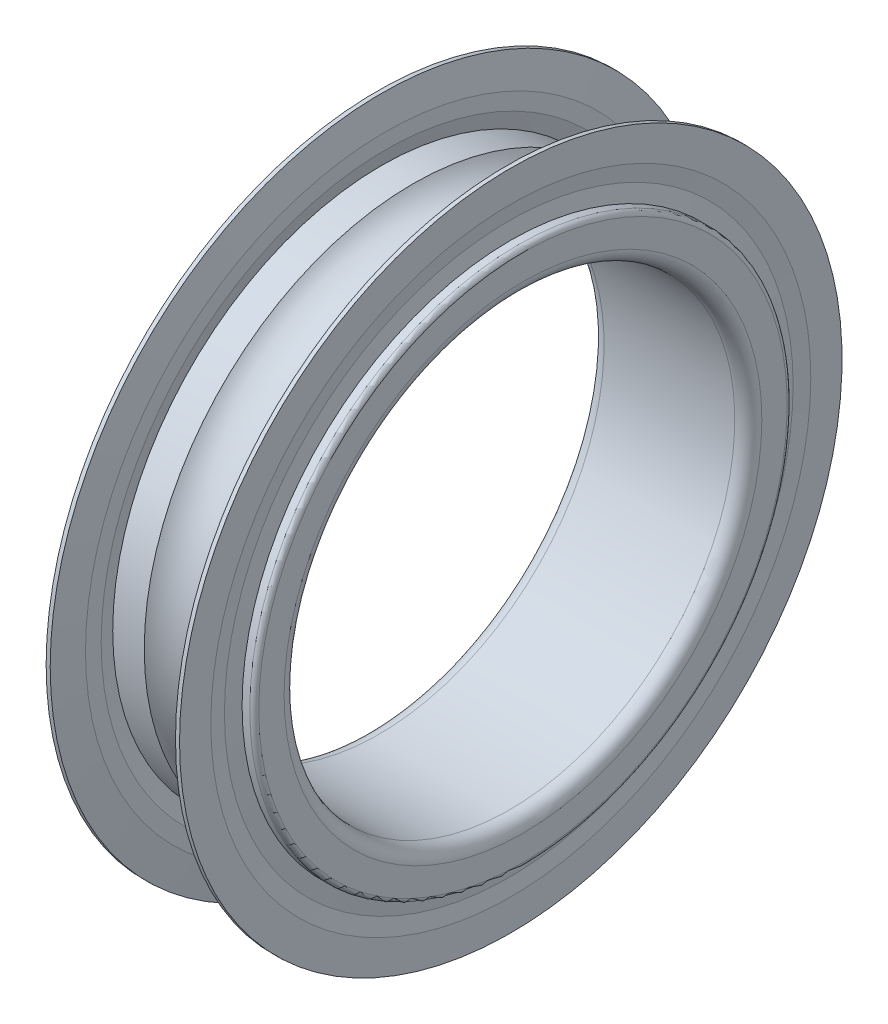
ISO-10303-21;
HEADER;
FILE_DESCRIPTION(('STEP AP214'),'2;1');
FILE_NAME('part.step','',(''),(''),'','','');
FILE_SCHEMA(('AUTOMOTIVE_DESIGN { 1 0 10303 214 1 1 1 1 }'));
ENDSEC;
DATA;
#1=APPLICATION_CONTEXT('core data for automotive mechanical design processes');
#2=APPLICATION_PROTOCOL_DEFINITION('international standard','automotive_design',2000,#1);
#3=PRODUCT_CONTEXT('',#1,'mechanical');
#4=PRODUCT('Part','Part','',(#3));
#5=PRODUCT_RELATED_PRODUCT_CATEGORY('part','',(#4));
#6=PRODUCT_DEFINITION_FORMATION('','',#4);
#7=PRODUCT_DEFINITION_CONTEXT('part definition',#1,'design');
#8=PRODUCT_DEFINITION('design','',#6,#7);
#9=PRODUCT_DEFINITION_SHAPE('','',#8);
#10=(LENGTH_UNIT() NAMED_UNIT(*) SI_UNIT(.MILLI.,.METRE.));
#11=(NAMED_UNIT(*) PLANE_ANGLE_UNIT() SI_UNIT($,.RADIAN.));
#12=(NAMED_UNIT(*) SI_UNIT($,.STERADIAN.) SOLID_ANGLE_UNIT());
#13=UNCERTAINTY_MEASURE_WITH_UNIT(LENGTH_MEASURE(1.E-05),#10,'distance_accuracy_value','');
#14=(GEOMETRIC_REPRESENTATION_CONTEXT(3) GLOBAL_UNCERTAINTY_ASSIGNED_CONTEXT((#13)) GLOBAL_UNIT_ASSIGNED_CONTEXT((#10,
#11,#12)) REPRESENTATION_CONTEXT('',''));
#15=CARTESIAN_POINT('',(0.,0.,0.));
#16=DIRECTION('',(0.,0.,1.));
#17=DIRECTION('',(1.,0.,0.));
#18=AXIS2_PLACEMENT_3D('',#15,#16,#17);
#19=CARTESIAN_POINT('',(0.,-12.0453733965146,-11.725));
#20=DIRECTION('',(-1.,0.,0.));
#21=DIRECTION('',(0.,0.,1.));
#22=AXIS2_PLACEMENT_3D('',#19,#20,#21);
#23=PLANE('',#22);
#24=CARTESIAN_POINT('',(0.,0.,0.));
#25=DIRECTION('',(-1.,0.,0.));
#26=DIRECTION('',(0.,0.,-1.));
#27=AXIS2_PLACEMENT_3D('',#24,#25,#26);
#28=CIRCLE('',#27,11.725000013978);
#29=CARTESIAN_POINT('',(0.,0.,-11.725000013978));
#30=VERTEX_POINT('',#29);
#31=EDGE_CURVE('E100',#30,#30,#28,.F.);
#32=ORIENTED_EDGE('',*,*,#31,.F.);
#33=EDGE_LOOP('',(#32));
#34=FACE_BOUND('',#33,.T.);
#35=CARTESIAN_POINT('',(0.,0.,0.));
#36=DIRECTION('',(1.,0.,0.));
#37=DIRECTION('',(0.,0.,1.));
#38=AXIS2_PLACEMENT_3D('',#35,#36,#37);
#39=CIRCLE('',#38,10.5999999999999);
#40=CARTESIAN_POINT('',(0.,0.,10.5999999999999));
#41=VERTEX_POINT('',#40);
#42=EDGE_CURVE('E97',#41,#41,#39,.T.);
#43=ORIENTED_EDGE('',*,*,#42,.T.);
#44=EDGE_LOOP('',(#43));
#45=FACE_BOUND('',#44,.T.);
#46=ADVANCED_FACE('F17',(#34,#45),#23,.T.);
#47=CARTESIAN_POINT('',(7.,-12.0453734035495,11.725));
#48=DIRECTION('',(1.,0.,0.));
#49=DIRECTION('',(0.,0.,-1.));
#50=AXIS2_PLACEMENT_3D('',#47,#48,#49);
#51=PLANE('',#50);
#52=CARTESIAN_POINT('',(7.,0.,0.));
#53=DIRECTION('',(1.,0.,0.));
#54=DIRECTION('',(0.,0.,1.));
#55=AXIS2_PLACEMENT_3D('',#52,#53,#54);
#56=CIRCLE('',#55,11.725);
#57=CARTESIAN_POINT('',(7.,0.,11.725));
#58=VERTEX_POINT('',#57);
#59=EDGE_CURVE('E94',#58,#58,#56,.T.);
#60=ORIENTED_EDGE('',*,*,#59,.T.);
#61=EDGE_LOOP('',(#60));
#62=FACE_BOUND('',#61,.T.);
#63=CARTESIAN_POINT('',(7.,0.,0.));
#64=DIRECTION('',(-1.,0.,0.));
#65=DIRECTION('',(0.,0.,-1.));
#66=AXIS2_PLACEMENT_3D('',#63,#64,#65);
#67=CIRCLE('',#66,10.6);
#68=CARTESIAN_POINT('',(7.,0.,-10.6));
#69=VERTEX_POINT('',#68);
#70=EDGE_CURVE('E91',#69,#69,#67,.F.);
#71=ORIENTED_EDGE('',*,*,#70,.F.);
#72=EDGE_LOOP('',(#71));
#73=FACE_BOUND('',#72,.T.);
#74=ADVANCED_FACE('F109',(#62,#73),#51,.T.);
#75=CARTESIAN_POINT('',(0.9,-13.5597975760758,13.3125));
#76=DIRECTION('',(1.,0.,0.));
#77=DIRECTION('',(0.,0.,-1.));
#78=AXIS2_PLACEMENT_3D('',#75,#76,#77);
#79=PLANE('',#78);
#80=CARTESIAN_POINT('',(0.9,0.,0.));
#81=DIRECTION('',(1.,0.,0.));
#82=DIRECTION('',(0.,0.,1.));
#83=AXIS2_PLACEMENT_3D('',#80,#81,#82);
#84=CIRCLE('',#83,13.3125);
#85=CARTESIAN_POINT('',(0.9,0.,13.3125));
#86=VERTEX_POINT('',#85);
#87=EDGE_CURVE('E88',#86,#86,#84,.T.);
#88=ORIENTED_EDGE('',*,*,#87,.T.);
#89=EDGE_LOOP('',(#88));
#90=FACE_BOUND('',#89,.T.);
#91=CARTESIAN_POINT('',(0.9,0.,0.));
#92=DIRECTION('',(-1.,0.,0.));
#93=DIRECTION('',(0.,0.,-1.));
#94=AXIS2_PLACEMENT_3D('',#91,#92,#93);
#95=CIRCLE('',#94,12.61875);
#96=CARTESIAN_POINT('',(0.9,0.,-12.61875));
#97=VERTEX_POINT('',#96);
#98=EDGE_CURVE('E85',#97,#97,#95,.F.);
#99=ORIENTED_EDGE('',*,*,#98,.F.);
#100=EDGE_LOOP('',(#99));
#101=FACE_BOUND('',#100,.T.);
#102=ADVANCED_FACE('F218',(#90,#101),#79,.T.);
#103=CARTESIAN_POINT('',(0.54,-14.9730722443665,-14.7));
#104=DIRECTION('',(-1.,0.,0.));
#105=DIRECTION('',(0.,0.,1.));
#106=AXIS2_PLACEMENT_3D('',#103,#104,#105);
#107=PLANE('',#106);
#108=CARTESIAN_POINT('',(0.54,0.,0.));
#109=DIRECTION('',(-1.,0.,0.));
#110=DIRECTION('',(0.,0.,-1.));
#111=AXIS2_PLACEMENT_3D('',#108,#109,#110);
#112=CIRCLE('',#111,14.7);
#113=CARTESIAN_POINT('',(0.54,0.,-14.7));
#114=VERTEX_POINT('',#113);
#115=EDGE_CURVE('E82',#114,#114,#112,.F.);
#116=ORIENTED_EDGE('',*,*,#115,.F.);
#117=EDGE_LOOP('',(#116));
#118=FACE_BOUND('',#117,.T.);
#119=CARTESIAN_POINT('',(0.54,0.,0.));
#120=DIRECTION('',(1.,0.,0.));
#121=DIRECTION('',(0.,0.,1.));
#122=AXIS2_PLACEMENT_3D('',#119,#120,#121);
#123=CIRCLE('',#122,13.3125);
#124=CARTESIAN_POINT('',(0.54,0.,13.3125));
#125=VERTEX_POINT('',#124);
#126=EDGE_CURVE('E79',#125,#125,#123,.T.);
#127=ORIENTED_EDGE('',*,*,#126,.T.);
#128=EDGE_LOOP('',(#127));
#129=FACE_BOUND('',#128,.T.);
#130=ADVANCED_FACE('F201',(#118,#129),#107,.T.);
#131=CARTESIAN_POINT('',(6.1,-13.5597975760758,-13.3125));
#132=DIRECTION('',(-1.,0.,0.));
#133=DIRECTION('',(0.,0.,1.));
#134=AXIS2_PLACEMENT_3D('',#131,#132,#133);
#135=PLANE('',#134);
#136=CARTESIAN_POINT('',(6.1,0.,0.));
#137=DIRECTION('',(-1.,0.,0.));
#138=DIRECTION('',(0.,0.,-1.));
#139=AXIS2_PLACEMENT_3D('',#136,#137,#138);
#140=CIRCLE('',#139,13.3125);
#141=CARTESIAN_POINT('',(6.1,0.,-13.3125));
#142=VERTEX_POINT('',#141);
#143=EDGE_CURVE('E76',#142,#142,#140,.F.);
#144=ORIENTED_EDGE('',*,*,#143,.F.);
#145=EDGE_LOOP('',(#144));
#146=FACE_BOUND('',#145,.T.);
#147=CARTESIAN_POINT('',(6.1,0.,0.));
#148=DIRECTION('',(1.,0.,0.));
#149=DIRECTION('',(0.,0.,1.));
#150=AXIS2_PLACEMENT_3D('',#147,#148,#149);
#151=CIRCLE('',#150,12.61875);
#152=CARTESIAN_POINT('',(6.1,0.,12.61875));
#153=VERTEX_POINT('',#152);
#154=EDGE_CURVE('E73',#153,#153,#151,.T.);
#155=ORIENTED_EDGE('',*,*,#154,.T.);
#156=EDGE_LOOP('',(#155));
#157=FACE_BOUND('',#156,.T.);
#158=ADVANCED_FACE('F192',(#146,#157),#135,.T.);
#159=CARTESIAN_POINT('',(6.46,-14.9730722274429,14.7));
#160=DIRECTION('',(1.,0.,0.));
#161=DIRECTION('',(0.,0.,-1.));
#162=AXIS2_PLACEMENT_3D('',#159,#160,#161);
#163=PLANE('',#162);
#164=CARTESIAN_POINT('',(6.46,0.,0.));
#165=DIRECTION('',(1.,0.,0.));
#166=DIRECTION('',(0.,-1.16855761650625E-09,1.));
#167=AXIS2_PLACEMENT_3D('',#164,#165,#166);
#168=CIRCLE('',#167,14.7);
#169=CARTESIAN_POINT('',(6.46,-1.71777969626419E-08,14.7));
#170=VERTEX_POINT('',#169);
#171=EDGE_CURVE('E70',#170,#170,#168,.T.);
#172=ORIENTED_EDGE('',*,*,#171,.T.);
#173=EDGE_LOOP('',(#172));
#174=FACE_BOUND('',#173,.T.);
#175=CARTESIAN_POINT('',(6.46,0.,0.));
#176=DIRECTION('',(-1.,0.,0.));
#177=DIRECTION('',(0.,0.,-1.));
#178=AXIS2_PLACEMENT_3D('',#175,#176,#177);
#179=CIRCLE('',#178,13.3125);
#180=CARTESIAN_POINT('',(6.46,0.,-13.3125));
#181=VERTEX_POINT('',#180);
#182=EDGE_CURVE('E67',#181,#181,#179,.F.);
#183=ORIENTED_EDGE('',*,*,#182,.F.);
#184=EDGE_LOOP('',(#183));
#185=FACE_BOUND('',#184,.T.);
#186=ADVANCED_FACE('F189',(#174,#185),#163,.T.);
#187=CARTESIAN_POINT('',(50.,0.,0.));
#188=DIRECTION('',(1.,0.,0.));
#189=DIRECTION('',(0.,1.92337823786001E-10,1.));
#190=AXIS2_PLACEMENT_3D('',#187,#188,#189);
#191=CYLINDRICAL_SURFACE('',#190,11.925);
#192=CARTESIAN_POINT('',(4.8808964479641,0.,0.));
#193=DIRECTION('',(1.,0.,0.));
#194=DIRECTION('',(0.,0.,1.));
#195=AXIS2_PLACEMENT_3D('',#192,#193,#194);
#196=CIRCLE('',#195,11.925);
#197=CARTESIAN_POINT('',(4.8808964479641,0.,11.925));
#198=VERTEX_POINT('',#197);
#199=EDGE_CURVE('E64',#198,#198,#196,.T.);
#200=ORIENTED_EDGE('',*,*,#199,.T.);
#201=EDGE_LOOP('',(#200));
#202=FACE_BOUND('',#201,.T.);
#203=CARTESIAN_POINT('',(6.28,0.,0.));
#204=DIRECTION('',(-1.,0.,0.));
#205=DIRECTION('',(0.,0.,-1.));
#206=AXIS2_PLACEMENT_3D('',#203,#204,#205);
#207=CIRCLE('',#206,11.925);
#208=CARTESIAN_POINT('',(6.28,0.,-11.925));
#209=VERTEX_POINT('',#208);
#210=EDGE_CURVE('E61',#209,#209,#207,.F.);
#211=ORIENTED_EDGE('',*,*,#210,.F.);
#212=EDGE_LOOP('',(#211));
#213=FACE_BOUND('',#212,.T.);
#214=ADVANCED_FACE('F191',(#202,#213),#191,.T.);
#215=CARTESIAN_POINT('',(50.,0.,0.));
#216=DIRECTION('',(1.,0.,0.));
#217=DIRECTION('',(0.,1.92337379696791E-10,1.));
#218=AXIS2_PLACEMENT_3D('',#215,#216,#217);
#219=CYLINDRICAL_SURFACE('',#218,11.925);
#220=CARTESIAN_POINT('',(0.200000000000003,0.,0.));
#221=DIRECTION('',(1.,0.,0.));
#222=DIRECTION('',(0.,0.,1.));
#223=AXIS2_PLACEMENT_3D('',#220,#221,#222);
#224=CIRCLE('',#223,11.925);
#225=CARTESIAN_POINT('',(0.200000000000003,0.,11.925));
#226=VERTEX_POINT('',#225);
#227=EDGE_CURVE('E58',#226,#226,#224,.T.);
#228=ORIENTED_EDGE('',*,*,#227,.T.);
#229=EDGE_LOOP('',(#228));
#230=FACE_BOUND('',#229,.T.);
#231=CARTESIAN_POINT('',(0.539999999999999,0.,0.));
#232=DIRECTION('',(-1.,0.,0.));
#233=DIRECTION('',(0.,0.,-1.));
#234=AXIS2_PLACEMENT_3D('',#231,#232,#233);
#235=CIRCLE('',#234,11.925);
#236=CARTESIAN_POINT('',(0.539999999999999,0.,-11.925));
#237=VERTEX_POINT('',#236);
#238=EDGE_CURVE('E55',#237,#237,#235,.F.);
#239=ORIENTED_EDGE('',*,*,#238,.F.);
#240=EDGE_LOOP('',(#239));
#241=FACE_BOUND('',#240,.T.);
#242=ADVANCED_FACE('F126',(#230,#241),#219,.T.);
#243=CARTESIAN_POINT('',(0.200000000000531,0.,0.));
#244=DIRECTION('',(1.,0.,0.));
#245=DIRECTION('',(0.,1.16848720733295E-09,1.));
#246=AXIS2_PLACEMENT_3D('',#243,#244,#245);
#247=TOROIDAL_SURFACE('',#246,11.7249999999995,0.200000000000532);
#248=ORIENTED_EDGE('',*,*,#31,.T.);
#249=EDGE_LOOP('',(#248));
#250=FACE_BOUND('',#249,.T.);
#251=ORIENTED_EDGE('',*,*,#227,.F.);
#252=EDGE_LOOP('',(#251));
#253=FACE_BOUND('',#252,.T.);
#254=ADVANCED_FACE('F104',(#250,#253),#247,.T.);
#255=CARTESIAN_POINT('',(0.599999999999877,0.,0.));
#256=DIRECTION('',(1.,0.,0.));
#257=DIRECTION('',(0.,0.,1.));
#258=AXIS2_PLACEMENT_3D('',#255,#256,#257);
#259=TOROIDAL_SURFACE('',#258,10.5999999999999,0.599999999999877);
#260=CARTESIAN_POINT('',(0.6,0.,0.));
#261=DIRECTION('',(1.,0.,0.));
#262=DIRECTION('',(0.,0.,1.));
#263=AXIS2_PLACEMENT_3D('',#260,#261,#262);
#264=CIRCLE('',#263,10.);
#265=CARTESIAN_POINT('',(0.6,0.,10.));
#266=VERTEX_POINT('',#265);
#267=EDGE_CURVE('E52',#266,#266,#264,.T.);
#268=ORIENTED_EDGE('',*,*,#267,.T.);
#269=EDGE_LOOP('',(#268));
#270=FACE_BOUND('',#269,.T.);
#271=ORIENTED_EDGE('',*,*,#42,.F.);
#272=EDGE_LOOP('',(#271));
#273=FACE_BOUND('',#272,.T.);
#274=ADVANCED_FACE('F113',(#270,#273),#259,.T.);
#275=CARTESIAN_POINT('',(50.,0.,0.));
#276=DIRECTION('',(1.,0.,0.));
#277=DIRECTION('',(0.,0.,1.));
#278=AXIS2_PLACEMENT_3D('',#275,#276,#277);
#279=CYLINDRICAL_SURFACE('',#278,10.);
#280=CARTESIAN_POINT('',(6.4,0.,0.));
#281=DIRECTION('',(1.,0.,0.));
#282=DIRECTION('',(0.,0.,1.));
#283=AXIS2_PLACEMENT_3D('',#280,#281,#282);
#284=CIRCLE('',#283,10.);
#285=CARTESIAN_POINT('',(6.4,0.,10.));
#286=VERTEX_POINT('',#285);
#287=EDGE_CURVE('E49',#286,#286,#284,.T.);
#288=ORIENTED_EDGE('',*,*,#287,.T.);
#289=EDGE_LOOP('',(#288));
#290=FACE_BOUND('',#289,.T.);
#291=ORIENTED_EDGE('',*,*,#267,.F.);
#292=EDGE_LOOP('',(#291));
#293=FACE_BOUND('',#292,.T.);
#294=ADVANCED_FACE('F115',(#290,#293),#279,.F.);
#295=CARTESIAN_POINT('',(6.40000000000007,0.,0.));
#296=DIRECTION('',(1.,0.,0.));
#297=DIRECTION('',(0.,0.,1.));
#298=AXIS2_PLACEMENT_3D('',#295,#296,#297);
#299=TOROIDAL_SURFACE('',#298,10.6,0.599999999999927);
#300=ORIENTED_EDGE('',*,*,#70,.T.);
#301=EDGE_LOOP('',(#300));
#302=FACE_BOUND('',#301,.T.);
#303=ORIENTED_EDGE('',*,*,#287,.F.);
#304=EDGE_LOOP('',(#303));
#305=FACE_BOUND('',#304,.T.);
#306=ADVANCED_FACE('F123',(#302,#305),#299,.T.);
#307=CARTESIAN_POINT('',(6.79999999999945,0.,0.));
#308=DIRECTION('',(1.,0.,0.));
#309=DIRECTION('',(0.,0.,1.));
#310=AXIS2_PLACEMENT_3D('',#307,#308,#309);
#311=TOROIDAL_SURFACE('',#310,11.7249999999995,0.200000000000546);
#312=CARTESIAN_POINT('',(6.79999999999945,0.,0.));
#313=DIRECTION('',(1.,0.,0.));
#314=DIRECTION('',(0.,0.,1.));
#315=AXIS2_PLACEMENT_3D('',#312,#313,#314);
#316=CIRCLE('',#315,11.925);
#317=CARTESIAN_POINT('',(6.79999999999945,0.,11.925));
#318=VERTEX_POINT('',#317);
#319=EDGE_CURVE('E46',#318,#318,#316,.T.);
#320=ORIENTED_EDGE('',*,*,#319,.T.);
#321=EDGE_LOOP('',(#320));
#322=FACE_BOUND('',#321,.T.);
#323=ORIENTED_EDGE('',*,*,#59,.F.);
#324=EDGE_LOOP('',(#323));
#325=FACE_BOUND('',#324,.T.);
#326=ADVANCED_FACE('F132',(#322,#325),#311,.T.);
#327=CARTESIAN_POINT('',(50.,0.,0.));
#328=DIRECTION('',(1.,0.,0.));
#329=DIRECTION('',(0.,0.,1.));
#330=AXIS2_PLACEMENT_3D('',#327,#328,#329);
#331=CYLINDRICAL_SURFACE('',#330,11.925);
#332=CARTESIAN_POINT('',(6.46,0.,0.));
#333=DIRECTION('',(1.,0.,0.));
#334=DIRECTION('',(0.,0.,1.));
#335=AXIS2_PLACEMENT_3D('',#332,#333,#334);
#336=CIRCLE('',#335,11.925);
#337=CARTESIAN_POINT('',(6.46,0.,11.925));
#338=VERTEX_POINT('',#337);
#339=EDGE_CURVE('E43',#338,#338,#336,.T.);
#340=ORIENTED_EDGE('',*,*,#339,.T.);
#341=EDGE_LOOP('',(#340));
#342=FACE_BOUND('',#341,.T.);
#343=ORIENTED_EDGE('',*,*,#319,.F.);
#344=EDGE_LOOP('',(#343));
#345=FACE_BOUND('',#344,.T.);
#346=ADVANCED_FACE('F136',(#342,#345),#331,.T.);
#347=CARTESIAN_POINT('',(3.5,0.,0.));
#348=DIRECTION('',(1.,0.,0.));
#349=DIRECTION('',(0.,0.,1.));
#350=AXIS2_PLACEMENT_3D('',#347,#348,#349);
#351=TOROIDAL_SURFACE('',#350,13.,1.7499999999999);
#352=ORIENTED_EDGE('',*,*,#199,.F.);
#353=EDGE_LOOP('',(#352));
#354=FACE_BOUND('',#353,.T.);
#355=CARTESIAN_POINT('',(2.11910355203595,0.,0.));
#356=DIRECTION('',(1.,0.,0.));
#357=DIRECTION('',(0.,0.,1.));
#358=AXIS2_PLACEMENT_3D('',#355,#356,#357);
#359=CIRCLE('',#358,11.925);
#360=CARTESIAN_POINT('',(2.11910355203595,0.,11.925));
#361=VERTEX_POINT('',#360);
#362=EDGE_CURVE('E40',#361,#361,#359,.T.);
#363=ORIENTED_EDGE('',*,*,#362,.T.);
#364=EDGE_LOOP('',(#363));
#365=FACE_BOUND('',#364,.T.);
#366=ADVANCED_FACE('F140',(#354,#365),#351,.F.);
#367=CARTESIAN_POINT('',(50.,0.,0.));
#368=DIRECTION('',(1.,0.,0.));
#369=DIRECTION('',(0.,0.,1.));
#370=AXIS2_PLACEMENT_3D('',#367,#368,#369);
#371=CYLINDRICAL_SURFACE('',#370,11.925);
#372=CARTESIAN_POINT('',(0.719999999999999,0.,0.));
#373=DIRECTION('',(1.,0.,0.));
#374=DIRECTION('',(0.,0.,1.));
#375=AXIS2_PLACEMENT_3D('',#372,#373,#374);
#376=CIRCLE('',#375,11.925);
#377=CARTESIAN_POINT('',(0.719999999999999,0.,11.925));
#378=VERTEX_POINT('',#377);
#379=EDGE_CURVE('E37',#378,#378,#376,.T.);
#380=ORIENTED_EDGE('',*,*,#379,.T.);
#381=EDGE_LOOP('',(#380));
#382=FACE_BOUND('',#381,.T.);
#383=ORIENTED_EDGE('',*,*,#362,.F.);
#384=EDGE_LOOP('',(#383));
#385=FACE_BOUND('',#384,.T.);
#386=ADVANCED_FACE('F144',(#382,#385),#371,.T.);
#387=CARTESIAN_POINT('',(0.63,0.,0.));
#388=DIRECTION('',(1.,0.,0.));
#389=DIRECTION('',(0.,1.92337379696791E-10,1.));
#390=AXIS2_PLACEMENT_3D('',#387,#388,#389);
#391=CONICAL_SURFACE('',#390,12.61875,1.44178711053552);
#392=ORIENTED_EDGE('',*,*,#238,.T.);
#393=EDGE_LOOP('',(#392));
#394=FACE_BOUND('',#393,.T.);
#395=CARTESIAN_POINT('',(0.63,0.,0.));
#396=DIRECTION('',(-1.,0.,0.));
#397=DIRECTION('',(0.,0.,-1.));
#398=AXIS2_PLACEMENT_3D('',#395,#396,#397);
#399=CIRCLE('',#398,12.61875);
#400=CARTESIAN_POINT('',(0.63,0.,-12.61875));
#401=VERTEX_POINT('',#400);
#402=EDGE_CURVE('E32',#401,#401,#399,.F.);
#403=ORIENTED_EDGE('',*,*,#402,.F.);
#404=EDGE_LOOP('',(#403));
#405=FACE_BOUND('',#404,.T.);
#406=ADVANCED_FACE('F148',(#394,#405),#391,.T.);
#407=CARTESIAN_POINT('',(0.900000000000001,0.,0.));
#408=DIRECTION('',(1.,0.,0.));
#409=DIRECTION('',(0.,1.16843214027093E-09,1.));
#410=AXIS2_PLACEMENT_3D('',#407,#408,#409);
#411=CONICAL_SURFACE('',#410,12.61875,1.3169346485913);
#412=ORIENTED_EDGE('',*,*,#98,.T.);
#413=EDGE_LOOP('',(#412));
#414=FACE_BOUND('',#413,.T.);
#415=ORIENTED_EDGE('',*,*,#379,.F.);
#416=EDGE_LOOP('',(#415));
#417=FACE_BOUND('',#416,.T.);
#418=ADVANCED_FACE('F152',(#414,#417),#411,.F.);
#419=CARTESIAN_POINT('',(0.719999999999999,0.,0.));
#420=DIRECTION('',(-1.,0.,0.));
#421=DIRECTION('',(0.,0.,-1.));
#422=AXIS2_PLACEMENT_3D('',#419,#420,#421);
#423=CONICAL_SURFACE('',#422,14.7,1.44178711053552);
#424=ORIENTED_EDGE('',*,*,#87,.F.);
#425=EDGE_LOOP('',(#424));
#426=FACE_BOUND('',#425,.T.);
#427=CARTESIAN_POINT('',(0.72,0.,0.));
#428=DIRECTION('',(1.,0.,0.));
#429=DIRECTION('',(0.,0.,1.));
#430=AXIS2_PLACEMENT_3D('',#427,#428,#429);
#431=CIRCLE('',#430,14.7);
#432=CARTESIAN_POINT('',(0.72,0.,14.7));
#433=VERTEX_POINT('',#432);
#434=EDGE_CURVE('E28',#433,#433,#431,.T.);
#435=ORIENTED_EDGE('',*,*,#434,.T.);
#436=EDGE_LOOP('',(#435));
#437=FACE_BOUND('',#436,.T.);
#438=ADVANCED_FACE('F156',(#426,#437),#423,.T.);
#439=CARTESIAN_POINT('',(2.,0.,0.));
#440=DIRECTION('',(1.,0.,0.));
#441=DIRECTION('',(0.,1.16855826160653E-09,1.));
#442=AXIS2_PLACEMENT_3D('',#439,#440,#441);
#443=CYLINDRICAL_SURFACE('',#442,14.7);
#444=ORIENTED_EDGE('',*,*,#115,.T.);
#445=EDGE_LOOP('',(#444));
#446=FACE_BOUND('',#445,.T.);
#447=ORIENTED_EDGE('',*,*,#434,.F.);
#448=EDGE_LOOP('',(#447));
#449=FACE_BOUND('',#448,.T.);
#450=ADVANCED_FACE('F160',(#446,#449),#443,.T.);
#451=CARTESIAN_POINT('',(0.54,0.,0.));
#452=DIRECTION('',(-1.,0.,0.));
#453=DIRECTION('',(0.,0.,-1.));
#454=AXIS2_PLACEMENT_3D('',#451,#452,#453);
#455=CONICAL_SURFACE('',#454,13.3125,1.44178711053552);
#456=ORIENTED_EDGE('',*,*,#402,.T.);
#457=EDGE_LOOP('',(#456));
#458=FACE_BOUND('',#457,.T.);
#459=ORIENTED_EDGE('',*,*,#126,.F.);
#460=EDGE_LOOP('',(#459));
#461=FACE_BOUND('',#460,.T.);
#462=ADVANCED_FACE('F164',(#458,#461),#455,.F.);
#463=CARTESIAN_POINT('',(6.28,0.,0.));
#464=DIRECTION('',(1.,0.,0.));
#465=DIRECTION('',(0.,1.92327609734175E-10,1.));
#466=AXIS2_PLACEMENT_3D('',#463,#464,#465);
#467=CONICAL_SURFACE('',#466,14.7,1.44178711053552);
#468=ORIENTED_EDGE('',*,*,#143,.T.);
#469=EDGE_LOOP('',(#468));
#470=FACE_BOUND('',#469,.T.);
#471=CARTESIAN_POINT('',(6.28,0.,0.));
#472=DIRECTION('',(-1.,0.,0.));
#473=DIRECTION('',(0.,0.,-1.));
#474=AXIS2_PLACEMENT_3D('',#471,#472,#473);
#475=CIRCLE('',#474,14.7);
#476=CARTESIAN_POINT('',(6.28,0.,-14.7));
#477=VERTEX_POINT('',#476);
#478=EDGE_CURVE('E24',#477,#477,#475,.F.);
#479=ORIENTED_EDGE('',*,*,#478,.F.);
#480=EDGE_LOOP('',(#479));
#481=FACE_BOUND('',#480,.T.);
#482=ADVANCED_FACE('F168',(#470,#481),#467,.T.);
#483=CARTESIAN_POINT('',(6.1,0.,0.));
#484=DIRECTION('',(-1.,0.,0.));
#485=DIRECTION('',(0.,0.,-1.));
#486=AXIS2_PLACEMENT_3D('',#483,#484,#485);
#487=CONICAL_SURFACE('',#486,12.61875,1.3169346485913);
#488=ORIENTED_EDGE('',*,*,#210,.T.);
#489=EDGE_LOOP('',(#488));
#490=FACE_BOUND('',#489,.T.);
#491=ORIENTED_EDGE('',*,*,#154,.F.);
#492=EDGE_LOOP('',(#491));
#493=FACE_BOUND('',#492,.T.);
#494=ADVANCED_FACE('F172',(#490,#493),#487,.F.);
#495=CARTESIAN_POINT('',(6.37,0.,0.));
#496=DIRECTION('',(-1.,0.,0.));
#497=DIRECTION('',(0.,0.,-1.));
#498=AXIS2_PLACEMENT_3D('',#495,#496,#497);
#499=CONICAL_SURFACE('',#498,12.61875,1.44178711053552);
#500=ORIENTED_EDGE('',*,*,#339,.F.);
#501=EDGE_LOOP('',(#500));
#502=FACE_BOUND('',#501,.T.);
#503=CARTESIAN_POINT('',(6.37,0.,0.));
#504=DIRECTION('',(1.,0.,0.));
#505=DIRECTION('',(0.,0.,1.));
#506=AXIS2_PLACEMENT_3D('',#503,#504,#505);
#507=CIRCLE('',#506,12.61875);
#508=CARTESIAN_POINT('',(6.37,0.,12.61875));
#509=VERTEX_POINT('',#508);
#510=EDGE_CURVE('E10',#509,#509,#507,.T.);
#511=ORIENTED_EDGE('',*,*,#510,.T.);
#512=EDGE_LOOP('',(#511));
#513=FACE_BOUND('',#512,.T.);
#514=ADVANCED_FACE('F176',(#502,#513),#499,.T.);
#515=CARTESIAN_POINT('',(6.46,0.,0.));
#516=DIRECTION('',(1.,0.,0.));
#517=DIRECTION('',(0.,0.,1.));
#518=AXIS2_PLACEMENT_3D('',#515,#516,#517);
#519=CONICAL_SURFACE('',#518,13.3125,1.44178711053552);
#520=ORIENTED_EDGE('',*,*,#182,.T.);
#521=EDGE_LOOP('',(#520));
#522=FACE_BOUND('',#521,.T.);
#523=ORIENTED_EDGE('',*,*,#510,.F.);
#524=EDGE_LOOP('',(#523));
#525=FACE_BOUND('',#524,.T.);
#526=ADVANCED_FACE('F179',(#522,#525),#519,.F.);
#527=CARTESIAN_POINT('',(2.,0.,0.));
#528=DIRECTION('',(1.,0.,0.));
#529=DIRECTION('',(0.,7.69310071542659E-10,1.));
#530=AXIS2_PLACEMENT_3D('',#527,#528,#529);
#531=CYLINDRICAL_SURFACE('',#530,14.7);
#532=ORIENTED_EDGE('',*,*,#478,.T.);
#533=EDGE_LOOP('',(#532));
#534=FACE_BOUND('',#533,.T.);
#535=ORIENTED_EDGE('',*,*,#171,.F.);
#536=EDGE_LOOP('',(#535));
#537=FACE_BOUND('',#536,.T.);
#538=ADVANCED_FACE('F19',(#534,#537),#531,.T.);
#539=CLOSED_SHELL('',(#46,#74,#102,#130,#158,#186,#214,#242,#254,#274,#294,#306,#326,#346,#366,
#386,#406,#418,#438,#450,#462,#482,#494,#514,#526,#538));
#540=MANIFOLD_SOLID_BREP('B1',#539);
#541=ADVANCED_BREP_SHAPE_REPRESENTATION('',(#18,#540),#14);
#542=SHAPE_DEFINITION_REPRESENTATION(#9,#541);
ENDSEC;
END-ISO-10303-21;
